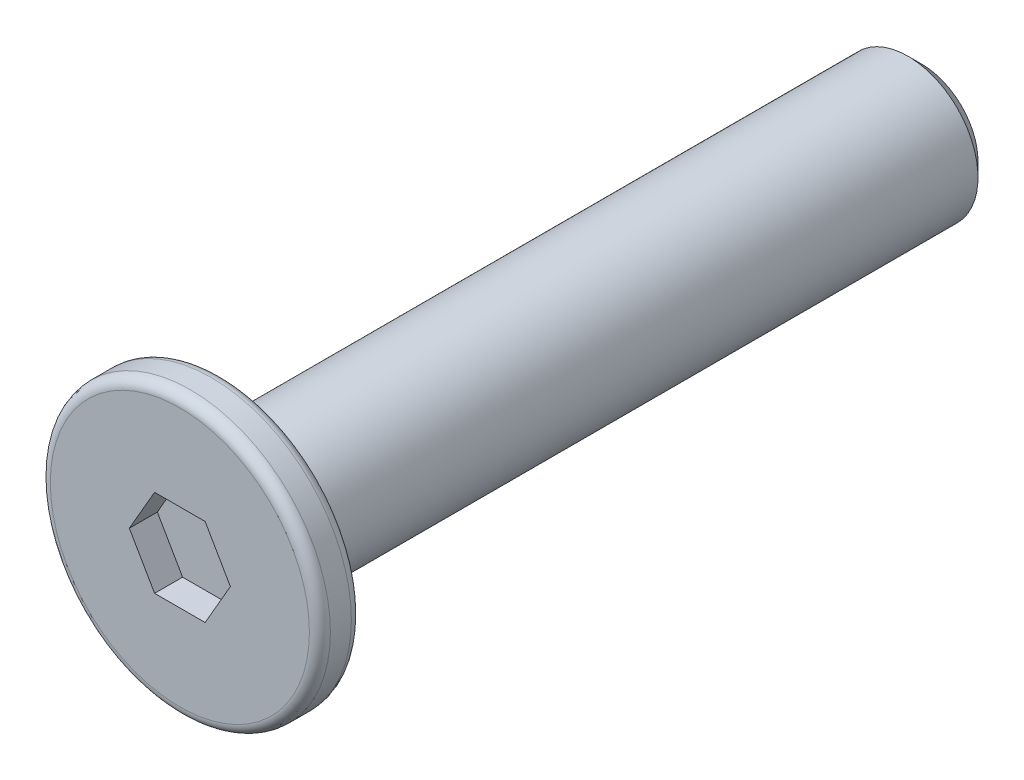
ISO-10303-21;
HEADER;
FILE_DESCRIPTION(('STEP AP214'),'2;1');
FILE_NAME('part.step','',(''),(''),'','','');
FILE_SCHEMA(('AUTOMOTIVE_DESIGN { 1 0 10303 214 1 1 1 1 }'));
ENDSEC;
DATA;
#1=APPLICATION_CONTEXT('core data for automotive mechanical design processes');
#2=APPLICATION_PROTOCOL_DEFINITION('international standard','automotive_design',2000,#1);
#3=PRODUCT_CONTEXT('',#1,'mechanical');
#4=PRODUCT('Part','Part','',(#3));
#5=PRODUCT_RELATED_PRODUCT_CATEGORY('part','',(#4));
#6=PRODUCT_DEFINITION_FORMATION('','',#4);
#7=PRODUCT_DEFINITION_CONTEXT('part definition',#1,'design');
#8=PRODUCT_DEFINITION('design','',#6,#7);
#9=PRODUCT_DEFINITION_SHAPE('','',#8);
#10=(LENGTH_UNIT() NAMED_UNIT(*) SI_UNIT(.MILLI.,.METRE.));
#11=(NAMED_UNIT(*) PLANE_ANGLE_UNIT() SI_UNIT($,.RADIAN.));
#12=(NAMED_UNIT(*) SI_UNIT($,.STERADIAN.) SOLID_ANGLE_UNIT());
#13=UNCERTAINTY_MEASURE_WITH_UNIT(LENGTH_MEASURE(1.E-05),#10,'distance_accuracy_value','');
#14=(GEOMETRIC_REPRESENTATION_CONTEXT(3) GLOBAL_UNCERTAINTY_ASSIGNED_CONTEXT((#13)) GLOBAL_UNIT_ASSIGNED_CONTEXT((#10,
#11,#12)) REPRESENTATION_CONTEXT('',''));
#15=CARTESIAN_POINT('',(0.,0.,0.));
#16=DIRECTION('',(0.,0.,1.));
#17=DIRECTION('',(1.,0.,0.));
#18=AXIS2_PLACEMENT_3D('',#15,#16,#17);
#19=CARTESIAN_POINT('',(0.,0.,0.6));
#20=DIRECTION('',(0.,0.,-1.));
#21=DIRECTION('',(-1.,0.,0.));
#22=AXIS2_PLACEMENT_3D('',#19,#20,#21);
#23=CYLINDRICAL_SURFACE('',#22,4.);
#24=CARTESIAN_POINT('',(0.,0.,-0.3));
#25=DIRECTION('',(0.,0.,1.));
#26=DIRECTION('',(1.,0.,0.));
#27=AXIS2_PLACEMENT_3D('',#24,#25,#26);
#28=CIRCLE('',#27,4.);
#29=CARTESIAN_POINT('',(4.,0.,-0.3));
#30=VERTEX_POINT('',#29);
#31=EDGE_CURVE('E154',#30,#30,#28,.T.);
#32=ORIENTED_EDGE('',*,*,#31,.T.);
#33=EDGE_LOOP('',(#32));
#34=FACE_BOUND('',#33,.T.);
#35=CARTESIAN_POINT('',(0.,0.,0.3));
#36=DIRECTION('',(0.,0.,1.));
#37=DIRECTION('',(1.,0.,0.));
#38=AXIS2_PLACEMENT_3D('',#35,#36,#37);
#39=CIRCLE('',#38,4.);
#40=CARTESIAN_POINT('',(4.,0.,0.3));
#41=VERTEX_POINT('',#40);
#42=EDGE_CURVE('E151',#41,#41,#39,.F.);
#43=ORIENTED_EDGE('',*,*,#42,.T.);
#44=EDGE_LOOP('',(#43));
#45=FACE_BOUND('',#44,.T.);
#46=ADVANCED_FACE('F35',(#34,#45),#23,.T.);
#47=CARTESIAN_POINT('',(0.,0.,0.6));
#48=DIRECTION('',(0.,0.,1.));
#49=DIRECTION('',(1.,0.,0.));
#50=AXIS2_PLACEMENT_3D('',#47,#48,#49);
#51=PLANE('',#50);
#52=CARTESIAN_POINT('',(0.,0.,0.6));
#53=DIRECTION('',(0.,0.,1.));
#54=DIRECTION('',(1.,0.,0.));
#55=AXIS2_PLACEMENT_3D('',#52,#53,#54);
#56=CIRCLE('',#55,3.7);
#57=CARTESIAN_POINT('',(3.7,0.,0.6));
#58=VERTEX_POINT('',#57);
#59=EDGE_CURVE('E11',#58,#58,#56,.T.);
#60=ORIENTED_EDGE('',*,*,#59,.T.);
#61=EDGE_LOOP('',(#60));
#62=FACE_BOUND('',#61,.T.);
#63=DIRECTION('',(0.5,0.866025403784439,0.));
#64=VECTOR('',#63,1.);
#65=CARTESIAN_POINT('',(0.721687836487033,-1.25,0.6));
#66=LINE('',#65,#64);
#67=CARTESIAN_POINT('',(0.721687836487033,-1.25,0.6));
#68=VERTEX_POINT('',#67);
#69=CARTESIAN_POINT('',(1.44337567297407,0.,0.6));
#70=VERTEX_POINT('',#69);
#71=EDGE_CURVE('E50',#68,#70,#66,.T.);
#72=ORIENTED_EDGE('',*,*,#71,.F.);
#73=DIRECTION('',(1.,0.,0.));
#74=VECTOR('',#73,1.);
#75=CARTESIAN_POINT('',(-0.721687836487031,-1.25,0.6));
#76=LINE('',#75,#74);
#77=CARTESIAN_POINT('',(-0.721687836487031,-1.25,0.6));
#78=VERTEX_POINT('',#77);
#79=EDGE_CURVE('E133',#78,#68,#76,.T.);
#80=ORIENTED_EDGE('',*,*,#79,.F.);
#81=DIRECTION('',(0.5,-0.866025403784438,0.));
#82=VECTOR('',#81,1.);
#83=CARTESIAN_POINT('',(-1.44337567297406,0.,0.6));
#84=LINE('',#83,#82);
#85=CARTESIAN_POINT('',(-1.44337567297406,0.,0.6));
#86=VERTEX_POINT('',#85);
#87=EDGE_CURVE('E131',#86,#78,#84,.T.);
#88=ORIENTED_EDGE('',*,*,#87,.F.);
#89=DIRECTION('',(-0.5,-0.866025403784439,0.));
#90=VECTOR('',#89,1.);
#91=CARTESIAN_POINT('',(-0.721687836487032,1.25,0.6));
#92=LINE('',#91,#90);
#93=CARTESIAN_POINT('',(-0.721687836487032,1.25,0.6));
#94=VERTEX_POINT('',#93);
#95=EDGE_CURVE('E98',#94,#86,#92,.T.);
#96=ORIENTED_EDGE('',*,*,#95,.F.);
#97=DIRECTION('',(-1.,0.,0.));
#98=VECTOR('',#97,1.);
#99=CARTESIAN_POINT('',(0.721687836487032,1.25,0.6));
#100=LINE('',#99,#98);
#101=CARTESIAN_POINT('',(0.721687836487032,1.25,0.6));
#102=VERTEX_POINT('',#101);
#103=EDGE_CURVE('E127',#102,#94,#100,.T.);
#104=ORIENTED_EDGE('',*,*,#103,.F.);
#105=DIRECTION('',(-0.500000000000001,0.866025403784438,0.));
#106=VECTOR('',#105,1.);
#107=CARTESIAN_POINT('',(1.44337567297407,0.,0.6));
#108=LINE('',#107,#106);
#109=EDGE_CURVE('E124',#70,#102,#108,.T.);
#110=ORIENTED_EDGE('',*,*,#109,.F.);
#111=EDGE_LOOP('',(#72,#80,#88,#96,#104,#110));
#112=FACE_BOUND('',#111,.T.);
#113=ADVANCED_FACE('F169',(#62,#112),#51,.T.);
#114=CARTESIAN_POINT('',(0.,0.,-0.6));
#115=DIRECTION('',(0.,0.,1.));
#116=DIRECTION('',(1.,0.,0.));
#117=AXIS2_PLACEMENT_3D('',#114,#115,#116);
#118=PLANE('',#117);
#119=CARTESIAN_POINT('',(0.,0.,-0.6));
#120=DIRECTION('',(0.,0.,1.));
#121=DIRECTION('',(1.,0.,0.));
#122=AXIS2_PLACEMENT_3D('',#119,#120,#121);
#123=CIRCLE('',#122,3.7);
#124=CARTESIAN_POINT('',(3.7,0.,-0.6));
#125=VERTEX_POINT('',#124);
#126=EDGE_CURVE('E43',#125,#125,#123,.F.);
#127=ORIENTED_EDGE('',*,*,#126,.T.);
#128=EDGE_LOOP('',(#127));
#129=FACE_BOUND('',#128,.T.);
#130=CARTESIAN_POINT('',(0.,0.,-0.6));
#131=DIRECTION('',(0.,0.,-1.));
#132=DIRECTION('',(-1.,0.,0.));
#133=AXIS2_PLACEMENT_3D('',#130,#131,#132);
#134=CIRCLE('',#133,2.);
#135=CARTESIAN_POINT('',(-2.,0.,-0.6));
#136=VERTEX_POINT('',#135);
#137=EDGE_CURVE('E137',#136,#136,#134,.T.);
#138=ORIENTED_EDGE('',*,*,#137,.F.);
#139=EDGE_LOOP('',(#138));
#140=FACE_BOUND('',#139,.T.);
#141=ADVANCED_FACE('F159',(#129,#140),#118,.F.);
#142=CARTESIAN_POINT('',(0.,0.,-20.6));
#143=DIRECTION('',(0.,0.,1.));
#144=DIRECTION('',(1.,0.,0.));
#145=AXIS2_PLACEMENT_3D('',#142,#143,#144);
#146=CYLINDRICAL_SURFACE('',#145,2.);
#147=CARTESIAN_POINT('',(0.,0.,-20.2));
#148=DIRECTION('',(0.,0.,-1.));
#149=DIRECTION('',(-1.,0.,0.));
#150=AXIS2_PLACEMENT_3D('',#147,#148,#149);
#151=CIRCLE('',#150,2.);
#152=CARTESIAN_POINT('',(-2.,0.,-20.2));
#153=VERTEX_POINT('',#152);
#154=EDGE_CURVE('E148',#153,#153,#151,.F.);
#155=ORIENTED_EDGE('',*,*,#154,.T.);
#156=EDGE_LOOP('',(#155));
#157=FACE_BOUND('',#156,.T.);
#158=ORIENTED_EDGE('',*,*,#137,.T.);
#159=EDGE_LOOP('',(#158));
#160=FACE_BOUND('',#159,.T.);
#161=ADVANCED_FACE('F204',(#157,#160),#146,.T.);
#162=CARTESIAN_POINT('',(0.,0.,-20.6));
#163=DIRECTION('',(0.,0.,-1.));
#164=DIRECTION('',(-1.,0.,0.));
#165=AXIS2_PLACEMENT_3D('',#162,#163,#164);
#166=PLANE('',#165);
#167=CARTESIAN_POINT('',(0.,0.,-20.6));
#168=DIRECTION('',(0.,0.,-1.));
#169=DIRECTION('',(-1.,0.,0.));
#170=AXIS2_PLACEMENT_3D('',#167,#168,#169);
#171=CIRCLE('',#170,1.6);
#172=CARTESIAN_POINT('',(-1.6,0.,-20.6));
#173=VERTEX_POINT('',#172);
#174=EDGE_CURVE('E145',#173,#173,#171,.T.);
#175=ORIENTED_EDGE('',*,*,#174,.T.);
#176=EDGE_LOOP('',(#175));
#177=FACE_BOUND('',#176,.T.);
#178=ADVANCED_FACE('F196',(#177),#166,.T.);
#179=CARTESIAN_POINT('',(0.,0.,-20.6));
#180=DIRECTION('',(0.,0.,1.));
#181=DIRECTION('',(1.,0.,0.));
#182=AXIS2_PLACEMENT_3D('',#179,#180,#181);
#183=CONICAL_SURFACE('',#182,1.6,0.785398163397446);
#184=ORIENTED_EDGE('',*,*,#154,.F.);
#185=EDGE_LOOP('',(#184));
#186=FACE_BOUND('',#185,.T.);
#187=ORIENTED_EDGE('',*,*,#174,.F.);
#188=EDGE_LOOP('',(#187));
#189=FACE_BOUND('',#188,.T.);
#190=ADVANCED_FACE('F189',(#186,#189),#183,.T.);
#191=CARTESIAN_POINT('',(0.721687836487033,-1.25,-0.2));
#192=DIRECTION('',(0.866025403784439,-0.5,0.));
#193=DIRECTION('',(0.5,0.866025403784439,0.));
#194=AXIS2_PLACEMENT_3D('',#191,#192,#193);
#195=PLANE('',#194);
#196=ORIENTED_EDGE('',*,*,#71,.T.);
#197=DIRECTION('',(0.,0.,1.));
#198=VECTOR('',#197,1.);
#199=CARTESIAN_POINT('',(1.44337567297407,0.,-0.2));
#200=LINE('',#199,#198);
#201=CARTESIAN_POINT('',(1.44337567297407,0.,-0.2));
#202=VERTEX_POINT('',#201);
#203=EDGE_CURVE('E80',#202,#70,#200,.T.);
#204=ORIENTED_EDGE('',*,*,#203,.F.);
#205=DIRECTION('',(0.5,0.866025403784439,0.));
#206=VECTOR('',#205,1.);
#207=CARTESIAN_POINT('',(0.721687836487033,-1.25,-0.2));
#208=LINE('',#207,#206);
#209=CARTESIAN_POINT('',(0.721687836487033,-1.25,-0.2));
#210=VERTEX_POINT('',#209);
#211=EDGE_CURVE('E135',#210,#202,#208,.T.);
#212=ORIENTED_EDGE('',*,*,#211,.F.);
#213=DIRECTION('',(0.,0.,1.));
#214=VECTOR('',#213,1.);
#215=CARTESIAN_POINT('',(0.721687836487033,-1.25,-0.2));
#216=LINE('',#215,#214);
#217=EDGE_CURVE('E58',#210,#68,#216,.T.);
#218=ORIENTED_EDGE('',*,*,#217,.T.);
#219=EDGE_LOOP('',(#196,#204,#212,#218));
#220=FACE_BOUND('',#219,.T.);
#221=ADVANCED_FACE('F186',(#220),#195,.F.);
#222=CARTESIAN_POINT('',(-0.721687836487031,-1.25,-0.2));
#223=DIRECTION('',(0.,-1.,0.));
#224=DIRECTION('',(0.,0.,-1.));
#225=AXIS2_PLACEMENT_3D('',#222,#223,#224);
#226=PLANE('',#225);
#227=ORIENTED_EDGE('',*,*,#79,.T.);
#228=ORIENTED_EDGE('',*,*,#217,.F.);
#229=DIRECTION('',(1.,0.,0.));
#230=VECTOR('',#229,1.);
#231=CARTESIAN_POINT('',(-0.721687836487031,-1.25,-0.2));
#232=LINE('',#231,#230);
#233=CARTESIAN_POINT('',(-0.721687836487031,-1.25,-0.2));
#234=VERTEX_POINT('',#233);
#235=EDGE_CURVE('E110',#234,#210,#232,.T.);
#236=ORIENTED_EDGE('',*,*,#235,.F.);
#237=DIRECTION('',(0.,0.,1.));
#238=VECTOR('',#237,1.);
#239=CARTESIAN_POINT('',(-0.721687836487031,-1.25,-0.2));
#240=LINE('',#239,#238);
#241=EDGE_CURVE('E102',#234,#78,#240,.T.);
#242=ORIENTED_EDGE('',*,*,#241,.T.);
#243=EDGE_LOOP('',(#227,#228,#236,#242));
#244=FACE_BOUND('',#243,.T.);
#245=ADVANCED_FACE('F188',(#244),#226,.F.);
#246=CARTESIAN_POINT('',(-1.44337567297406,0.,-0.2));
#247=DIRECTION('',(-0.866025403784438,-0.5,0.));
#248=DIRECTION('',(0.5,-0.866025403784438,0.));
#249=AXIS2_PLACEMENT_3D('',#246,#247,#248);
#250=PLANE('',#249);
#251=ORIENTED_EDGE('',*,*,#87,.T.);
#252=ORIENTED_EDGE('',*,*,#241,.F.);
#253=DIRECTION('',(0.5,-0.866025403784438,0.));
#254=VECTOR('',#253,1.);
#255=CARTESIAN_POINT('',(-1.44337567297406,0.,-0.2));
#256=LINE('',#255,#254);
#257=CARTESIAN_POINT('',(-1.44337567297406,0.,-0.2));
#258=VERTEX_POINT('',#257);
#259=EDGE_CURVE('E106',#258,#234,#256,.T.);
#260=ORIENTED_EDGE('',*,*,#259,.F.);
#261=DIRECTION('',(0.,0.,1.));
#262=VECTOR('',#261,1.);
#263=CARTESIAN_POINT('',(-1.44337567297406,0.,-0.2));
#264=LINE('',#263,#262);
#265=EDGE_CURVE('E91',#258,#86,#264,.T.);
#266=ORIENTED_EDGE('',*,*,#265,.T.);
#267=EDGE_LOOP('',(#251,#252,#260,#266));
#268=FACE_BOUND('',#267,.T.);
#269=ADVANCED_FACE('F107',(#268),#250,.F.);
#270=CARTESIAN_POINT('',(-0.721687836487032,1.25,-0.2));
#271=DIRECTION('',(-0.866025403784439,0.5,0.));
#272=DIRECTION('',(-0.5,-0.866025403784439,0.));
#273=AXIS2_PLACEMENT_3D('',#270,#271,#272);
#274=PLANE('',#273);
#275=ORIENTED_EDGE('',*,*,#95,.T.);
#276=ORIENTED_EDGE('',*,*,#265,.F.);
#277=DIRECTION('',(-0.5,-0.866025403784439,0.));
#278=VECTOR('',#277,1.);
#279=CARTESIAN_POINT('',(-0.721687836487032,1.25,-0.2));
#280=LINE('',#279,#278);
#281=CARTESIAN_POINT('',(-0.721687836487032,1.25,-0.2));
#282=VERTEX_POINT('',#281);
#283=EDGE_CURVE('E95',#282,#258,#280,.T.);
#284=ORIENTED_EDGE('',*,*,#283,.F.);
#285=DIRECTION('',(0.,0.,1.));
#286=VECTOR('',#285,1.);
#287=CARTESIAN_POINT('',(-0.721687836487032,1.25,-0.2));
#288=LINE('',#287,#286);
#289=EDGE_CURVE('E103',#282,#94,#288,.T.);
#290=ORIENTED_EDGE('',*,*,#289,.T.);
#291=EDGE_LOOP('',(#275,#276,#284,#290));
#292=FACE_BOUND('',#291,.T.);
#293=ADVANCED_FACE('F93',(#292),#274,.F.);
#294=CARTESIAN_POINT('',(0.721687836487032,1.25,-0.2));
#295=DIRECTION('',(0.,1.,0.));
#296=DIRECTION('',(0.,0.,1.));
#297=AXIS2_PLACEMENT_3D('',#294,#295,#296);
#298=PLANE('',#297);
#299=ORIENTED_EDGE('',*,*,#103,.T.);
#300=ORIENTED_EDGE('',*,*,#289,.F.);
#301=DIRECTION('',(-1.,0.,0.));
#302=VECTOR('',#301,1.);
#303=CARTESIAN_POINT('',(0.721687836487032,1.25,-0.2));
#304=LINE('',#303,#302);
#305=CARTESIAN_POINT('',(0.721687836487032,1.25,-0.2));
#306=VERTEX_POINT('',#305);
#307=EDGE_CURVE('E116',#306,#282,#304,.T.);
#308=ORIENTED_EDGE('',*,*,#307,.F.);
#309=DIRECTION('',(0.,0.,1.));
#310=VECTOR('',#309,1.);
#311=CARTESIAN_POINT('',(0.721687836487032,1.25,-0.2));
#312=LINE('',#311,#310);
#313=EDGE_CURVE('E140',#306,#102,#312,.T.);
#314=ORIENTED_EDGE('',*,*,#313,.T.);
#315=EDGE_LOOP('',(#299,#300,#308,#314));
#316=FACE_BOUND('',#315,.T.);
#317=ADVANCED_FACE('F257',(#316),#298,.F.);
#318=CARTESIAN_POINT('',(1.44337567297407,0.,-0.2));
#319=DIRECTION('',(0.866025403784438,0.500000000000001,0.));
#320=DIRECTION('',(-0.500000000000001,0.866025403784438,0.));
#321=AXIS2_PLACEMENT_3D('',#318,#319,#320);
#322=PLANE('',#321);
#323=ORIENTED_EDGE('',*,*,#109,.T.);
#324=ORIENTED_EDGE('',*,*,#313,.F.);
#325=DIRECTION('',(-0.500000000000001,0.866025403784438,0.));
#326=VECTOR('',#325,1.);
#327=CARTESIAN_POINT('',(1.44337567297407,0.,-0.2));
#328=LINE('',#327,#326);
#329=EDGE_CURVE('E118',#202,#306,#328,.T.);
#330=ORIENTED_EDGE('',*,*,#329,.F.);
#331=ORIENTED_EDGE('',*,*,#203,.T.);
#332=EDGE_LOOP('',(#323,#324,#330,#331));
#333=FACE_BOUND('',#332,.T.);
#334=ADVANCED_FACE('F184',(#333),#322,.F.);
#335=CARTESIAN_POINT('',(0.,0.,-0.2));
#336=DIRECTION('',(0.,0.,1.));
#337=DIRECTION('',(1.,0.,0.));
#338=AXIS2_PLACEMENT_3D('',#335,#336,#337);
#339=PLANE('',#338);
#340=ORIENTED_EDGE('',*,*,#211,.T.);
#341=ORIENTED_EDGE('',*,*,#329,.T.);
#342=ORIENTED_EDGE('',*,*,#307,.T.);
#343=ORIENTED_EDGE('',*,*,#283,.T.);
#344=ORIENTED_EDGE('',*,*,#259,.T.);
#345=ORIENTED_EDGE('',*,*,#235,.T.);
#346=EDGE_LOOP('',(#340,#341,#342,#343,#344,#345));
#347=FACE_BOUND('',#346,.T.);
#348=ADVANCED_FACE('F113',(#347),#339,.T.);
#349=CARTESIAN_POINT('',(0.,0.,-0.3));
#350=DIRECTION('',(0.,0.,1.));
#351=DIRECTION('',(1.,0.,0.));
#352=AXIS2_PLACEMENT_3D('',#349,#350,#351);
#353=TOROIDAL_SURFACE('',#352,3.7,0.3);
#354=ORIENTED_EDGE('',*,*,#126,.F.);
#355=EDGE_LOOP('',(#354));
#356=FACE_BOUND('',#355,.T.);
#357=ORIENTED_EDGE('',*,*,#31,.F.);
#358=EDGE_LOOP('',(#357));
#359=FACE_BOUND('',#358,.T.);
#360=ADVANCED_FACE('F162',(#356,#359),#353,.T.);
#361=CARTESIAN_POINT('',(0.,0.,0.3));
#362=DIRECTION('',(0.,0.,1.));
#363=DIRECTION('',(1.,0.,0.));
#364=AXIS2_PLACEMENT_3D('',#361,#362,#363);
#365=TOROIDAL_SURFACE('',#364,3.7,0.3);
#366=ORIENTED_EDGE('',*,*,#42,.F.);
#367=EDGE_LOOP('',(#366));
#368=FACE_BOUND('',#367,.T.);
#369=ORIENTED_EDGE('',*,*,#59,.F.);
#370=EDGE_LOOP('',(#369));
#371=FACE_BOUND('',#370,.T.);
#372=ADVANCED_FACE('F37',(#368,#371),#365,.T.);
#373=CLOSED_SHELL('',(#46,#113,#141,#161,#178,#190,#221,#245,#269,#293,#317,#334,#348,#360,#372));
#374=MANIFOLD_SOLID_BREP('B2',#373);
#375=ADVANCED_BREP_SHAPE_REPRESENTATION('',(#18,#374),#14);
#376=SHAPE_DEFINITION_REPRESENTATION(#9,#375);
ENDSEC;
END-ISO-10303-21;
